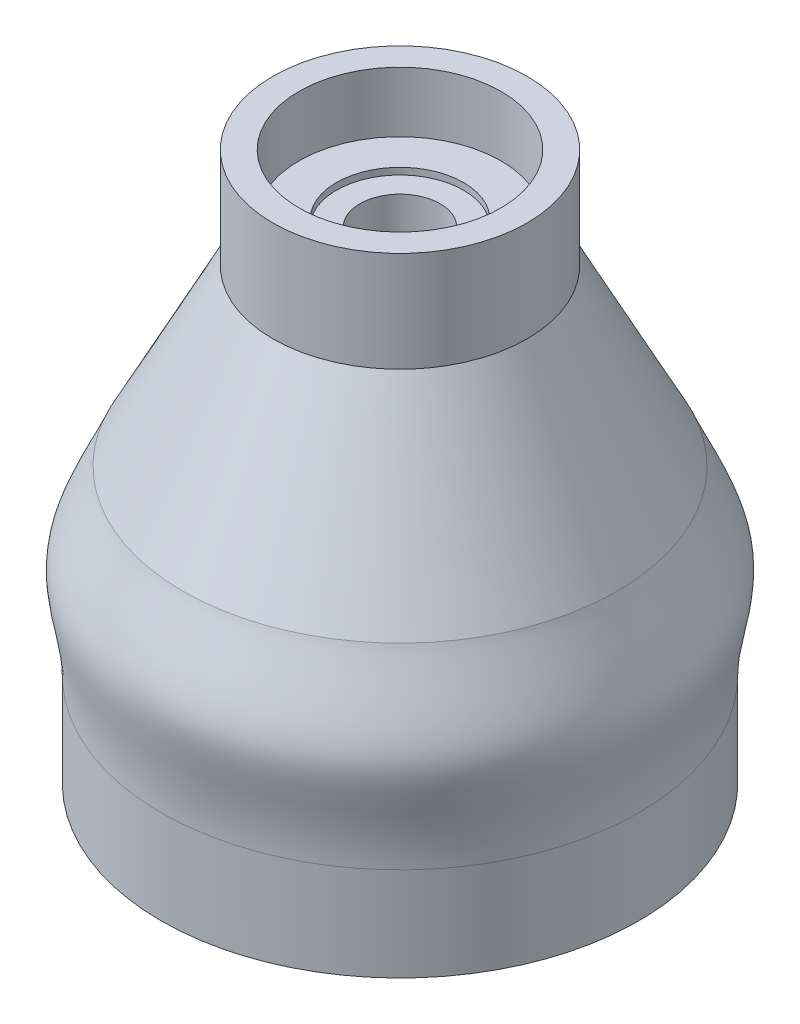
ISO-10303-21;
HEADER;
FILE_DESCRIPTION(('STEP AP214'),'2;1');
FILE_NAME('part.step','',(''),(''),'','','');
FILE_SCHEMA(('AUTOMOTIVE_DESIGN { 1 0 10303 214 1 1 1 1 }'));
ENDSEC;
DATA;
#1=APPLICATION_CONTEXT('core data for automotive mechanical design processes');
#2=APPLICATION_PROTOCOL_DEFINITION('international standard','automotive_design',2000,#1);
#3=PRODUCT_CONTEXT('',#1,'mechanical');
#4=PRODUCT('Part','Part','',(#3));
#5=PRODUCT_RELATED_PRODUCT_CATEGORY('part','',(#4));
#6=PRODUCT_DEFINITION_FORMATION('','',#4);
#7=PRODUCT_DEFINITION_CONTEXT('part definition',#1,'design');
#8=PRODUCT_DEFINITION('design','',#6,#7);
#9=PRODUCT_DEFINITION_SHAPE('','',#8);
#10=(LENGTH_UNIT() NAMED_UNIT(*) SI_UNIT(.MILLI.,.METRE.));
#11=(NAMED_UNIT(*) PLANE_ANGLE_UNIT() SI_UNIT($,.RADIAN.));
#12=(NAMED_UNIT(*) SI_UNIT($,.STERADIAN.) SOLID_ANGLE_UNIT());
#13=UNCERTAINTY_MEASURE_WITH_UNIT(LENGTH_MEASURE(1.E-05),#10,'distance_accuracy_value','');
#14=(GEOMETRIC_REPRESENTATION_CONTEXT(3) GLOBAL_UNCERTAINTY_ASSIGNED_CONTEXT((#13)) GLOBAL_UNIT_ASSIGNED_CONTEXT((#10,
#11,#12)) REPRESENTATION_CONTEXT('',''));
#15=CARTESIAN_POINT('',(0.,0.,0.));
#16=DIRECTION('',(0.,0.,1.));
#17=DIRECTION('',(1.,0.,0.));
#18=AXIS2_PLACEMENT_3D('',#15,#16,#17);
#19=CARTESIAN_POINT('',(0.,36.,9.50000000000001));
#20=DIRECTION('',(0.,1.,0.));
#21=DIRECTION('',(0.,0.,1.));
#22=AXIS2_PLACEMENT_3D('',#19,#20,#21);
#23=PLANE('',#22);
#24=CARTESIAN_POINT('',(0.,36.,0.));
#25=DIRECTION('',(0.,-1.,0.));
#26=DIRECTION('',(0.,0.,-1.));
#27=AXIS2_PLACEMENT_3D('',#24,#25,#26);
#28=CIRCLE('',#27,9.50000000000001);
#29=CARTESIAN_POINT('',(0.,36.,-9.50000000000001));
#30=VERTEX_POINT('',#29);
#31=EDGE_CURVE('E133',#30,#30,#28,.T.);
#32=ORIENTED_EDGE('',*,*,#31,.F.);
#33=EDGE_LOOP('',(#32));
#34=FACE_BOUND('',#33,.T.);
#35=CARTESIAN_POINT('',(0.,36.,0.));
#36=DIRECTION('',(0.,-1.,0.));
#37=DIRECTION('',(0.,0.,-1.));
#38=AXIS2_PLACEMENT_3D('',#35,#36,#37);
#39=CIRCLE('',#38,15.1);
#40=CARTESIAN_POINT('',(0.,36.,-15.1));
#41=VERTEX_POINT('',#40);
#42=EDGE_CURVE('E91',#41,#41,#39,.T.);
#43=ORIENTED_EDGE('',*,*,#42,.T.);
#44=EDGE_LOOP('',(#43));
#45=FACE_BOUND('',#44,.T.);
#46=ADVANCED_FACE('F71',(#34,#45),#23,.F.);
#47=CARTESIAN_POINT('',(0.,0.,0.));
#48=DIRECTION('',(0.,-1.,0.));
#49=DIRECTION('',(0.,0.,-1.));
#50=AXIS2_PLACEMENT_3D('',#47,#48,#49);
#51=CYLINDRICAL_SURFACE('',#50,15.1);
#52=ORIENTED_EDGE('',*,*,#42,.F.);
#53=EDGE_LOOP('',(#52));
#54=FACE_BOUND('',#53,.T.);
#55=CARTESIAN_POINT('',(0.,27.,0.));
#56=DIRECTION('',(0.,-1.,0.));
#57=DIRECTION('',(0.,0.,-1.));
#58=AXIS2_PLACEMENT_3D('',#55,#56,#57);
#59=CIRCLE('',#58,15.1);
#60=CARTESIAN_POINT('',(0.,27.,-15.1));
#61=VERTEX_POINT('',#60);
#62=EDGE_CURVE('E94',#61,#61,#59,.T.);
#63=ORIENTED_EDGE('',*,*,#62,.T.);
#64=EDGE_LOOP('',(#63));
#65=FACE_BOUND('',#64,.T.);
#66=ADVANCED_FACE('F163',(#54,#65),#51,.F.);
#67=CARTESIAN_POINT('',(0.,27.,31.2));
#68=DIRECTION('',(0.,1.,0.));
#69=DIRECTION('',(0.,0.,1.));
#70=AXIS2_PLACEMENT_3D('',#67,#68,#69);
#71=PLANE('',#70);
#72=ORIENTED_EDGE('',*,*,#62,.F.);
#73=EDGE_LOOP('',(#72));
#74=FACE_BOUND('',#73,.T.);
#75=CARTESIAN_POINT('',(0.,27.,0.));
#76=DIRECTION('',(0.,-1.,0.));
#77=DIRECTION('',(0.,0.,-1.));
#78=AXIS2_PLACEMENT_3D('',#75,#76,#77);
#79=CIRCLE('',#78,31.2);
#80=CARTESIAN_POINT('',(0.,27.,-31.2));
#81=VERTEX_POINT('',#80);
#82=EDGE_CURVE('E97',#81,#81,#79,.T.);
#83=ORIENTED_EDGE('',*,*,#82,.T.);
#84=EDGE_LOOP('',(#83));
#85=FACE_BOUND('',#84,.T.);
#86=ADVANCED_FACE('F159',(#74,#85),#71,.F.);
#87=CARTESIAN_POINT('',(0.,0.,0.));
#88=DIRECTION('',(0.,-1.,0.));
#89=DIRECTION('',(0.,0.,-1.));
#90=AXIS2_PLACEMENT_3D('',#87,#88,#89);
#91=CYLINDRICAL_SURFACE('',#90,31.2);
#92=CARTESIAN_POINT('',(0.,1.73205080756891,0.));
#93=DIRECTION('',(0.,1.,0.));
#94=DIRECTION('',(0.,0.,1.));
#95=AXIS2_PLACEMENT_3D('',#92,#93,#94);
#96=CIRCLE('',#95,31.2);
#97=CARTESIAN_POINT('',(0.,1.73205080756891,31.2));
#98=VERTEX_POINT('',#97);
#99=EDGE_CURVE('E86',#98,#98,#96,.F.);
#100=ORIENTED_EDGE('',*,*,#99,.T.);
#101=EDGE_LOOP('',(#100));
#102=FACE_BOUND('',#101,.T.);
#103=ORIENTED_EDGE('',*,*,#82,.F.);
#104=EDGE_LOOP('',(#103));
#105=FACE_BOUND('',#104,.T.);
#106=ADVANCED_FACE('F156',(#102,#105),#91,.F.);
#107=CARTESIAN_POINT('',(0.,0.,35.7));
#108=DIRECTION('',(0.,1.,0.));
#109=DIRECTION('',(0.,0.,1.));
#110=AXIS2_PLACEMENT_3D('',#107,#108,#109);
#111=PLANE('',#110);
#112=CARTESIAN_POINT('',(0.,0.,0.));
#113=DIRECTION('',(0.,1.,0.));
#114=DIRECTION('',(0.,0.,1.));
#115=AXIS2_PLACEMENT_3D('',#112,#113,#114);
#116=CIRCLE('',#115,32.2);
#117=CARTESIAN_POINT('',(0.,0.,32.2));
#118=VERTEX_POINT('',#117);
#119=EDGE_CURVE('E78',#118,#118,#116,.T.);
#120=ORIENTED_EDGE('',*,*,#119,.T.);
#121=EDGE_LOOP('',(#120));
#122=FACE_BOUND('',#121,.T.);
#123=CARTESIAN_POINT('',(0.,0.,0.));
#124=DIRECTION('',(0.,1.,0.));
#125=DIRECTION('',(0.,0.,1.));
#126=AXIS2_PLACEMENT_3D('',#123,#124,#125);
#127=CIRCLE('',#126,33.9679491924311);
#128=CARTESIAN_POINT('',(0.,0.,33.9679491924311));
#129=VERTEX_POINT('',#128);
#130=EDGE_CURVE('E82',#129,#129,#127,.F.);
#131=ORIENTED_EDGE('',*,*,#130,.T.);
#132=EDGE_LOOP('',(#131));
#133=FACE_BOUND('',#132,.T.);
#134=ADVANCED_FACE('F153',(#122,#133),#111,.F.);
#135=CARTESIAN_POINT('',(0.,0.,0.));
#136=DIRECTION('',(0.,-1.,0.));
#137=DIRECTION('',(0.,0.,-1.));
#138=AXIS2_PLACEMENT_3D('',#135,#136,#137);
#139=CYLINDRICAL_SURFACE('',#138,35.7);
#140=CARTESIAN_POINT('',(0.,1.,0.));
#141=DIRECTION('',(0.,1.,0.));
#142=DIRECTION('',(0.,0.,1.));
#143=AXIS2_PLACEMENT_3D('',#140,#141,#142);
#144=CIRCLE('',#143,35.7);
#145=CARTESIAN_POINT('',(0.,1.,35.7));
#146=VERTEX_POINT('',#145);
#147=EDGE_CURVE('E11',#146,#146,#144,.T.);
#148=ORIENTED_EDGE('',*,*,#147,.T.);
#149=EDGE_LOOP('',(#148));
#150=FACE_BOUND('',#149,.T.);
#151=CARTESIAN_POINT('',(0.,15.,0.));
#152=DIRECTION('',(0.,-1.,0.));
#153=DIRECTION('',(0.,0.,-1.));
#154=AXIS2_PLACEMENT_3D('',#151,#152,#153);
#155=CIRCLE('',#154,35.7);
#156=CARTESIAN_POINT('',(0.,15.,-35.7));
#157=VERTEX_POINT('',#156);
#158=EDGE_CURVE('E100',#157,#157,#155,.T.);
#159=ORIENTED_EDGE('',*,*,#158,.T.);
#160=EDGE_LOOP('',(#159));
#161=FACE_BOUND('',#160,.T.);
#162=ADVANCED_FACE('F148',(#150,#161),#139,.T.);
#163=CARTESIAN_POINT('',(0.,42.0600054356706,32.4524276991259));
#164=CARTESIAN_POINT('',(0.,40.0314814099562,33.1907500639798));
#165=CARTESIAN_POINT('',(0.,34.0611170953038,36.3582394912263));
#166=CARTESIAN_POINT('',(0.,26.6218913794216,38.171141040001));
#167=CARTESIAN_POINT('',(0.,21.9984704684181,35.7));
#168=CARTESIAN_POINT('',(0.,15.,35.7));
#169=B_SPLINE_CURVE_WITH_KNOTS('',3,(#163,#164,#165,#166,#167,#168),.UNSPECIFIED.,.F.,.F.,(4,1,
1,4),(0.,0.380377788632843,0.480377788632843,1.),.UNSPECIFIED.);
#170=CARTESIAN_POINT('',(0.,0.,0.));
#171=DIRECTION('',(0.,-1.,0.));
#172=AXIS1_PLACEMENT('',#170,#171);
#173=SURFACE_OF_REVOLUTION('',#169,#172);
#174=ORIENTED_EDGE('',*,*,#158,.F.);
#175=EDGE_LOOP('',(#174));
#176=FACE_BOUND('',#175,.T.);
#177=CARTESIAN_POINT('',(0.,42.0600054356706,0.));
#178=DIRECTION('',(0.,-1.,0.));
#179=DIRECTION('',(0.,0.,-1.));
#180=AXIS2_PLACEMENT_3D('',#177,#178,#179);
#181=CIRCLE('',#180,32.4524276991259);
#182=CARTESIAN_POINT('',(0.,42.0600054356706,-32.4524276991259));
#183=VERTEX_POINT('',#182);
#184=EDGE_CURVE('E103',#183,#183,#181,.T.);
#185=ORIENTED_EDGE('',*,*,#184,.T.);
#186=EDGE_LOOP('',(#185));
#187=FACE_BOUND('',#186,.T.);
#188=ADVANCED_FACE('F143',(#176,#187),#173,.T.);
#189=CARTESIAN_POINT('',(0.,68.,0.));
#190=DIRECTION('',(0.,-1.,0.));
#191=DIRECTION('',(0.,0.,-1.));
#192=AXIS2_PLACEMENT_3D('',#189,#190,#191);
#193=CONICAL_SURFACE('',#192,19.,0.478415020676975);
#194=ORIENTED_EDGE('',*,*,#184,.F.);
#195=EDGE_LOOP('',(#194));
#196=FACE_BOUND('',#195,.T.);
#197=CARTESIAN_POINT('',(0.,68.,0.));
#198=DIRECTION('',(0.,-1.,0.));
#199=DIRECTION('',(0.,0.,-1.));
#200=AXIS2_PLACEMENT_3D('',#197,#198,#199);
#201=CIRCLE('',#200,19.);
#202=CARTESIAN_POINT('',(0.,68.,-19.));
#203=VERTEX_POINT('',#202);
#204=EDGE_CURVE('E106',#203,#203,#201,.T.);
#205=ORIENTED_EDGE('',*,*,#204,.T.);
#206=EDGE_LOOP('',(#205));
#207=FACE_BOUND('',#206,.T.);
#208=ADVANCED_FACE('F147',(#196,#207),#193,.T.);
#209=CARTESIAN_POINT('',(0.,0.,0.));
#210=DIRECTION('',(0.,-1.,0.));
#211=DIRECTION('',(0.,0.,-1.));
#212=AXIS2_PLACEMENT_3D('',#209,#210,#211);
#213=CYLINDRICAL_SURFACE('',#212,19.);
#214=ORIENTED_EDGE('',*,*,#204,.F.);
#215=EDGE_LOOP('',(#214));
#216=FACE_BOUND('',#215,.T.);
#217=CARTESIAN_POINT('',(0.,83.,0.));
#218=DIRECTION('',(0.,-1.,0.));
#219=DIRECTION('',(0.,0.,-1.));
#220=AXIS2_PLACEMENT_3D('',#217,#218,#219);
#221=CIRCLE('',#220,19.);
#222=CARTESIAN_POINT('',(0.,83.,-19.));
#223=VERTEX_POINT('',#222);
#224=EDGE_CURVE('E109',#223,#223,#221,.T.);
#225=ORIENTED_EDGE('',*,*,#224,.T.);
#226=EDGE_LOOP('',(#225));
#227=FACE_BOUND('',#226,.T.);
#228=ADVANCED_FACE('F217',(#216,#227),#213,.T.);
#229=CARTESIAN_POINT('',(0.,83.,19.));
#230=DIRECTION('',(0.,-1.,0.));
#231=DIRECTION('',(0.,0.,-1.));
#232=AXIS2_PLACEMENT_3D('',#229,#230,#231);
#233=PLANE('',#232);
#234=ORIENTED_EDGE('',*,*,#224,.F.);
#235=EDGE_LOOP('',(#234));
#236=FACE_BOUND('',#235,.T.);
#237=CARTESIAN_POINT('',(0.,83.,0.));
#238=DIRECTION('',(0.,-1.,0.));
#239=DIRECTION('',(0.,0.,-1.));
#240=AXIS2_PLACEMENT_3D('',#237,#238,#239);
#241=CIRCLE('',#240,15.1);
#242=CARTESIAN_POINT('',(0.,83.,-15.1));
#243=VERTEX_POINT('',#242);
#244=EDGE_CURVE('E112',#243,#243,#241,.T.);
#245=ORIENTED_EDGE('',*,*,#244,.T.);
#246=EDGE_LOOP('',(#245));
#247=FACE_BOUND('',#246,.T.);
#248=ADVANCED_FACE('F214',(#236,#247),#233,.F.);
#249=CARTESIAN_POINT('',(0.,0.,0.));
#250=DIRECTION('',(0.,-1.,0.));
#251=DIRECTION('',(0.,0.,-1.));
#252=AXIS2_PLACEMENT_3D('',#249,#250,#251);
#253=CYLINDRICAL_SURFACE('',#252,15.1);
#254=ORIENTED_EDGE('',*,*,#244,.F.);
#255=EDGE_LOOP('',(#254));
#256=FACE_BOUND('',#255,.T.);
#257=CARTESIAN_POINT('',(0.,74.,0.));
#258=DIRECTION('',(0.,-1.,0.));
#259=DIRECTION('',(0.,0.,-1.));
#260=AXIS2_PLACEMENT_3D('',#257,#258,#259);
#261=CIRCLE('',#260,15.1);
#262=CARTESIAN_POINT('',(0.,74.,-15.1));
#263=VERTEX_POINT('',#262);
#264=EDGE_CURVE('E115',#263,#263,#261,.T.);
#265=ORIENTED_EDGE('',*,*,#264,.T.);
#266=EDGE_LOOP('',(#265));
#267=FACE_BOUND('',#266,.T.);
#268=ADVANCED_FACE('F210',(#256,#267),#253,.F.);
#269=CARTESIAN_POINT('',(0.,74.,15.1));
#270=DIRECTION('',(0.,-1.,0.));
#271=DIRECTION('',(0.,0.,-1.));
#272=AXIS2_PLACEMENT_3D('',#269,#270,#271);
#273=PLANE('',#272);
#274=ORIENTED_EDGE('',*,*,#264,.F.);
#275=EDGE_LOOP('',(#274));
#276=FACE_BOUND('',#275,.T.);
#277=CARTESIAN_POINT('',(0.,74.,0.));
#278=DIRECTION('',(0.,-1.,0.));
#279=DIRECTION('',(0.,0.,-1.));
#280=AXIS2_PLACEMENT_3D('',#277,#278,#279);
#281=CIRCLE('',#280,9.50000000000001);
#282=CARTESIAN_POINT('',(0.,74.,-9.50000000000001));
#283=VERTEX_POINT('',#282);
#284=EDGE_CURVE('E118',#283,#283,#281,.T.);
#285=ORIENTED_EDGE('',*,*,#284,.T.);
#286=EDGE_LOOP('',(#285));
#287=FACE_BOUND('',#286,.T.);
#288=ADVANCED_FACE('F206',(#276,#287),#273,.F.);
#289=CARTESIAN_POINT('',(0.,0.,0.));
#290=DIRECTION('',(0.,-1.,0.));
#291=DIRECTION('',(0.,0.,-1.));
#292=AXIS2_PLACEMENT_3D('',#289,#290,#291);
#293=CYLINDRICAL_SURFACE('',#292,9.50000000000001);
#294=ORIENTED_EDGE('',*,*,#284,.F.);
#295=EDGE_LOOP('',(#294));
#296=FACE_BOUND('',#295,.T.);
#297=CARTESIAN_POINT('',(0.,73.,0.));
#298=DIRECTION('',(0.,-1.,0.));
#299=DIRECTION('',(0.,0.,-1.));
#300=AXIS2_PLACEMENT_3D('',#297,#298,#299);
#301=CIRCLE('',#300,9.50000000000001);
#302=CARTESIAN_POINT('',(0.,73.,-9.50000000000001));
#303=VERTEX_POINT('',#302);
#304=EDGE_CURVE('E121',#303,#303,#301,.T.);
#305=ORIENTED_EDGE('',*,*,#304,.T.);
#306=EDGE_LOOP('',(#305));
#307=FACE_BOUND('',#306,.T.);
#308=ADVANCED_FACE('F202',(#296,#307),#293,.F.);
#309=CARTESIAN_POINT('',(0.,73.,9.50000000000001));
#310=DIRECTION('',(0.,-1.,0.));
#311=DIRECTION('',(0.,0.,-1.));
#312=AXIS2_PLACEMENT_3D('',#309,#310,#311);
#313=PLANE('',#312);
#314=ORIENTED_EDGE('',*,*,#304,.F.);
#315=EDGE_LOOP('',(#314));
#316=FACE_BOUND('',#315,.T.);
#317=CARTESIAN_POINT('',(0.,73.,0.));
#318=DIRECTION('',(0.,-1.,0.));
#319=DIRECTION('',(0.,0.,-1.));
#320=AXIS2_PLACEMENT_3D('',#317,#318,#319);
#321=CIRCLE('',#320,6.00000000000001);
#322=CARTESIAN_POINT('',(0.,73.,-6.00000000000001));
#323=VERTEX_POINT('',#322);
#324=EDGE_CURVE('E124',#323,#323,#321,.T.);
#325=ORIENTED_EDGE('',*,*,#324,.T.);
#326=EDGE_LOOP('',(#325));
#327=FACE_BOUND('',#326,.T.);
#328=ADVANCED_FACE('F198',(#316,#327),#313,.F.);
#329=CARTESIAN_POINT('',(0.,0.,0.));
#330=DIRECTION('',(0.,-1.,0.));
#331=DIRECTION('',(0.,0.,-1.));
#332=AXIS2_PLACEMENT_3D('',#329,#330,#331);
#333=CYLINDRICAL_SURFACE('',#332,6.00000000000001);
#334=ORIENTED_EDGE('',*,*,#324,.F.);
#335=EDGE_LOOP('',(#334));
#336=FACE_BOUND('',#335,.T.);
#337=CARTESIAN_POINT('',(0.,37.,0.));
#338=DIRECTION('',(0.,-1.,0.));
#339=DIRECTION('',(0.,0.,-1.));
#340=AXIS2_PLACEMENT_3D('',#337,#338,#339);
#341=CIRCLE('',#340,6.00000000000001);
#342=CARTESIAN_POINT('',(0.,37.,-6.00000000000001));
#343=VERTEX_POINT('',#342);
#344=EDGE_CURVE('E127',#343,#343,#341,.T.);
#345=ORIENTED_EDGE('',*,*,#344,.T.);
#346=EDGE_LOOP('',(#345));
#347=FACE_BOUND('',#346,.T.);
#348=ADVANCED_FACE('F190',(#336,#347),#333,.F.);
#349=CARTESIAN_POINT('',(0.,37.,9.50000000000001));
#350=DIRECTION('',(0.,1.,0.));
#351=DIRECTION('',(0.,0.,1.));
#352=AXIS2_PLACEMENT_3D('',#349,#350,#351);
#353=PLANE('',#352);
#354=ORIENTED_EDGE('',*,*,#344,.F.);
#355=EDGE_LOOP('',(#354));
#356=FACE_BOUND('',#355,.T.);
#357=CARTESIAN_POINT('',(0.,37.,0.));
#358=DIRECTION('',(0.,-1.,0.));
#359=DIRECTION('',(0.,0.,-1.));
#360=AXIS2_PLACEMENT_3D('',#357,#358,#359);
#361=CIRCLE('',#360,9.50000000000001);
#362=CARTESIAN_POINT('',(0.,37.,-9.50000000000001));
#363=VERTEX_POINT('',#362);
#364=EDGE_CURVE('E130',#363,#363,#361,.T.);
#365=ORIENTED_EDGE('',*,*,#364,.T.);
#366=EDGE_LOOP('',(#365));
#367=FACE_BOUND('',#366,.T.);
#368=ADVANCED_FACE('F179',(#356,#367),#353,.F.);
#369=CARTESIAN_POINT('',(0.,0.,0.));
#370=DIRECTION('',(0.,-1.,0.));
#371=DIRECTION('',(0.,0.,-1.));
#372=AXIS2_PLACEMENT_3D('',#369,#370,#371);
#373=CYLINDRICAL_SURFACE('',#372,9.50000000000001);
#374=ORIENTED_EDGE('',*,*,#364,.F.);
#375=EDGE_LOOP('',(#374));
#376=FACE_BOUND('',#375,.T.);
#377=ORIENTED_EDGE('',*,*,#31,.T.);
#378=EDGE_LOOP('',(#377));
#379=FACE_BOUND('',#378,.T.);
#380=ADVANCED_FACE('F172',(#376,#379),#373,.F.);
#381=CARTESIAN_POINT('',(0.,1.73205080756891,0.));
#382=DIRECTION('',(0.,-1.,0.));
#383=DIRECTION('',(0.,0.,-1.));
#384=AXIS2_PLACEMENT_3D('',#381,#382,#383);
#385=CONICAL_SURFACE('',#384,31.2,0.523598775598295);
#386=ORIENTED_EDGE('',*,*,#119,.F.);
#387=EDGE_LOOP('',(#386));
#388=FACE_BOUND('',#387,.T.);
#389=ORIENTED_EDGE('',*,*,#99,.F.);
#390=EDGE_LOOP('',(#389));
#391=FACE_BOUND('',#390,.T.);
#392=ADVANCED_FACE('F170',(#388,#391),#385,.F.);
#393=CARTESIAN_POINT('',(0.,0.,0.));
#394=DIRECTION('',(0.,1.,0.));
#395=DIRECTION('',(0.,0.,1.));
#396=AXIS2_PLACEMENT_3D('',#393,#394,#395);
#397=CONICAL_SURFACE('',#396,33.9679491924311,1.04719755119659);
#398=ORIENTED_EDGE('',*,*,#147,.F.);
#399=EDGE_LOOP('',(#398));
#400=FACE_BOUND('',#399,.T.);
#401=ORIENTED_EDGE('',*,*,#130,.F.);
#402=EDGE_LOOP('',(#401));
#403=FACE_BOUND('',#402,.T.);
#404=ADVANCED_FACE('F73',(#400,#403),#397,.T.);
#405=CLOSED_SHELL('',(#46,#66,#86,#106,#134,#162,#188,#208,#228,#248,#268,#288,#308,#328,#348,
#368,#380,#392,#404));
#406=MANIFOLD_SOLID_BREP('B2',#405);
#407=ADVANCED_BREP_SHAPE_REPRESENTATION('',(#18,#406),#14);
#408=SHAPE_DEFINITION_REPRESENTATION(#9,#407);
ENDSEC;
END-ISO-10303-21;
